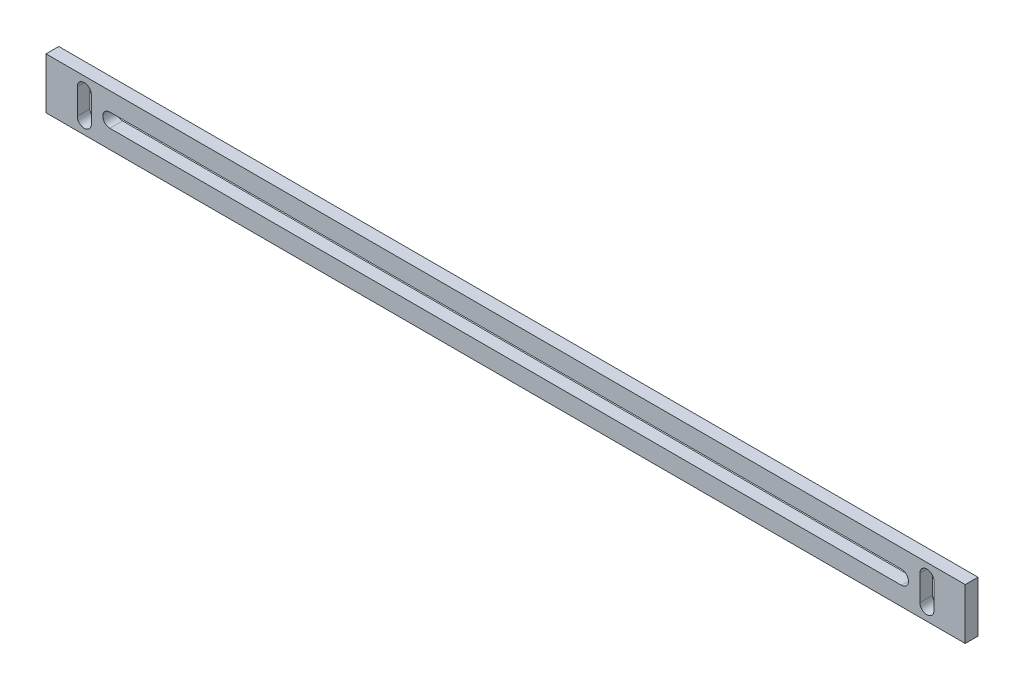
ISO-10303-21;
HEADER;
FILE_DESCRIPTION(('STEP AP214'),'2;1');
FILE_NAME('part.step','',(''),(''),'','','');
FILE_SCHEMA(('AUTOMOTIVE_DESIGN { 1 0 10303 214 1 1 1 1 }'));
ENDSEC;
DATA;
#1=APPLICATION_CONTEXT('core data for automotive mechanical design processes');
#2=APPLICATION_PROTOCOL_DEFINITION('international standard','automotive_design',2000,#1);
#3=PRODUCT_CONTEXT('',#1,'mechanical');
#4=PRODUCT('Part','Part','',(#3));
#5=PRODUCT_RELATED_PRODUCT_CATEGORY('part','',(#4));
#6=PRODUCT_DEFINITION_FORMATION('','',#4);
#7=PRODUCT_DEFINITION_CONTEXT('part definition',#1,'design');
#8=PRODUCT_DEFINITION('design','',#6,#7);
#9=PRODUCT_DEFINITION_SHAPE('','',#8);
#10=(LENGTH_UNIT() NAMED_UNIT(*) SI_UNIT(.MILLI.,.METRE.));
#11=(NAMED_UNIT(*) PLANE_ANGLE_UNIT() SI_UNIT($,.RADIAN.));
#12=(NAMED_UNIT(*) SI_UNIT($,.STERADIAN.) SOLID_ANGLE_UNIT());
#13=UNCERTAINTY_MEASURE_WITH_UNIT(LENGTH_MEASURE(1.E-05),#10,'distance_accuracy_value','');
#14=(GEOMETRIC_REPRESENTATION_CONTEXT(3) GLOBAL_UNCERTAINTY_ASSIGNED_CONTEXT((#13)) GLOBAL_UNIT_ASSIGNED_CONTEXT((#10,
#11,#12)) REPRESENTATION_CONTEXT('',''));
#15=CARTESIAN_POINT('',(0.,0.,0.));
#16=DIRECTION('',(0.,0.,1.));
#17=DIRECTION('',(1.,0.,0.));
#18=AXIS2_PLACEMENT_3D('',#15,#16,#17);
#19=CARTESIAN_POINT('',(0.,0.,5.));
#20=DIRECTION('',(0.,0.,1.));
#21=DIRECTION('',(1.,0.,0.));
#22=AXIS2_PLACEMENT_3D('',#19,#20,#21);
#23=PLANE('',#22);
#24=DIRECTION('',(0.,1.,0.));
#25=VECTOR('',#24,1.);
#26=CARTESIAN_POINT('',(162.25,0.,5.));
#27=LINE('',#26,#25);
#28=CARTESIAN_POINT('',(162.25,-5.,5.));
#29=VERTEX_POINT('',#28);
#30=CARTESIAN_POINT('',(162.25,5.,5.));
#31=VERTEX_POINT('',#30);
#32=EDGE_CURVE('E193',#29,#31,#27,.T.);
#33=ORIENTED_EDGE('',*,*,#32,.T.);
#34=CARTESIAN_POINT('',(165.,5.,5.));
#35=DIRECTION('',(0.,0.,-1.));
#36=DIRECTION('',(-1.,0.,0.));
#37=AXIS2_PLACEMENT_3D('',#34,#35,#36);
#38=CIRCLE('',#37,2.75);
#39=CARTESIAN_POINT('',(167.75,5.,5.));
#40=VERTEX_POINT('',#39);
#41=EDGE_CURVE('E196',#31,#40,#38,.T.);
#42=ORIENTED_EDGE('',*,*,#41,.T.);
#43=DIRECTION('',(0.,1.,0.));
#44=VECTOR('',#43,1.);
#45=CARTESIAN_POINT('',(167.75,0.,5.));
#46=LINE('',#45,#44);
#47=CARTESIAN_POINT('',(167.75,-5.,5.));
#48=VERTEX_POINT('',#47);
#49=EDGE_CURVE('E200',#48,#40,#46,.T.);
#50=ORIENTED_EDGE('',*,*,#49,.F.);
#51=CARTESIAN_POINT('',(165.,-5.00000000000001,5.));
#52=DIRECTION('',(0.,0.,-1.));
#53=DIRECTION('',(-1.,0.,0.));
#54=AXIS2_PLACEMENT_3D('',#51,#52,#53);
#55=CIRCLE('',#54,2.75);
#56=EDGE_CURVE('E202',#48,#29,#55,.T.);
#57=ORIENTED_EDGE('',*,*,#56,.T.);
#58=EDGE_LOOP('',(#33,#42,#50,#57));
#59=FACE_BOUND('',#58,.T.);
#60=DIRECTION('',(-1.,0.,0.));
#61=VECTOR('',#60,1.);
#62=CARTESIAN_POINT('',(0.,-2.75000000000008,5.));
#63=LINE('',#62,#61);
#64=CARTESIAN_POINT('',(155.,-2.75000000000008,5.));
#65=VERTEX_POINT('',#64);
#66=CARTESIAN_POINT('',(-155.,-2.75000000000008,5.));
#67=VERTEX_POINT('',#66);
#68=EDGE_CURVE('E222',#65,#67,#63,.T.);
#69=ORIENTED_EDGE('',*,*,#68,.T.);
#70=CARTESIAN_POINT('',(-155.,0.,5.));
#71=DIRECTION('',(0.,0.,-1.));
#72=DIRECTION('',(-1.,0.,0.));
#73=AXIS2_PLACEMENT_3D('',#70,#71,#72);
#74=CIRCLE('',#73,2.75000000000004);
#75=CARTESIAN_POINT('',(-155.,2.75000000000004,5.));
#76=VERTEX_POINT('',#75);
#77=EDGE_CURVE('E225',#67,#76,#74,.T.);
#78=ORIENTED_EDGE('',*,*,#77,.T.);
#79=DIRECTION('',(-1.,0.,0.));
#80=VECTOR('',#79,1.);
#81=CARTESIAN_POINT('',(0.,2.75,5.));
#82=LINE('',#81,#80);
#83=CARTESIAN_POINT('',(155.,2.75,5.));
#84=VERTEX_POINT('',#83);
#85=EDGE_CURVE('E229',#84,#76,#82,.T.);
#86=ORIENTED_EDGE('',*,*,#85,.F.);
#87=CARTESIAN_POINT('',(155.,0.,5.));
#88=DIRECTION('',(0.,0.,-1.));
#89=DIRECTION('',(-1.,0.,0.));
#90=AXIS2_PLACEMENT_3D('',#87,#88,#89);
#91=CIRCLE('',#90,2.75000000000004);
#92=EDGE_CURVE('E231',#84,#65,#91,.T.);
#93=ORIENTED_EDGE('',*,*,#92,.T.);
#94=EDGE_LOOP('',(#69,#78,#86,#93));
#95=FACE_BOUND('',#94,.T.);
#96=DIRECTION('',(-1.,0.,0.));
#97=VECTOR('',#96,1.);
#98=CARTESIAN_POINT('',(0.,10.,5.));
#99=LINE('',#98,#97);
#100=CARTESIAN_POINT('',(180.,9.99999999999998,5.));
#101=VERTEX_POINT('',#100);
#102=CARTESIAN_POINT('',(-180.,10.,5.));
#103=VERTEX_POINT('',#102);
#104=EDGE_CURVE('E49',#101,#103,#99,.T.);
#105=ORIENTED_EDGE('',*,*,#104,.T.);
#106=DIRECTION('',(0.,1.,0.));
#107=VECTOR('',#106,1.);
#108=CARTESIAN_POINT('',(-180.,-10.,5.));
#109=LINE('',#108,#107);
#110=CARTESIAN_POINT('',(-180.,-10.,5.));
#111=VERTEX_POINT('',#110);
#112=EDGE_CURVE('E173',#111,#103,#109,.T.);
#113=ORIENTED_EDGE('',*,*,#112,.F.);
#114=DIRECTION('',(1.,0.,0.));
#115=VECTOR('',#114,1.);
#116=CARTESIAN_POINT('',(0.,-10.,5.));
#117=LINE('',#116,#115);
#118=CARTESIAN_POINT('',(180.,-10.,5.));
#119=VERTEX_POINT('',#118);
#120=EDGE_CURVE('E11',#111,#119,#117,.T.);
#121=ORIENTED_EDGE('',*,*,#120,.T.);
#122=DIRECTION('',(0.,-1.,0.));
#123=VECTOR('',#122,1.);
#124=CARTESIAN_POINT('',(180.,-10.,5.));
#125=LINE('',#124,#123);
#126=EDGE_CURVE('E181',#101,#119,#125,.T.);
#127=ORIENTED_EDGE('',*,*,#126,.F.);
#128=EDGE_LOOP('',(#105,#113,#121,#127));
#129=FACE_BOUND('',#128,.T.);
#130=CARTESIAN_POINT('',(-165.,5.,5.));
#131=DIRECTION('',(0.,0.,-1.));
#132=DIRECTION('',(-1.,0.,0.));
#133=AXIS2_PLACEMENT_3D('',#130,#131,#132);
#134=CIRCLE('',#133,2.75);
#135=CARTESIAN_POINT('',(-167.75,5.00000000000003,5.));
#136=VERTEX_POINT('',#135);
#137=CARTESIAN_POINT('',(-162.25,5.00000000000003,5.));
#138=VERTEX_POINT('',#137);
#139=EDGE_CURVE('E260',#136,#138,#134,.T.);
#140=ORIENTED_EDGE('',*,*,#139,.T.);
#141=DIRECTION('',(0.,1.,0.));
#142=VECTOR('',#141,1.);
#143=CARTESIAN_POINT('',(-162.25,0.,5.));
#144=LINE('',#143,#142);
#145=CARTESIAN_POINT('',(-162.25,-5.00000000000003,5.));
#146=VERTEX_POINT('',#145);
#147=EDGE_CURVE('E251',#146,#138,#144,.T.);
#148=ORIENTED_EDGE('',*,*,#147,.F.);
#149=CARTESIAN_POINT('',(-165.,-5.,5.));
#150=DIRECTION('',(0.,0.,-1.));
#151=DIRECTION('',(-1.,0.,0.));
#152=AXIS2_PLACEMENT_3D('',#149,#150,#151);
#153=CIRCLE('',#152,2.75);
#154=CARTESIAN_POINT('',(-167.75,-5.00000000000003,5.));
#155=VERTEX_POINT('',#154);
#156=EDGE_CURVE('E253',#146,#155,#153,.T.);
#157=ORIENTED_EDGE('',*,*,#156,.T.);
#158=DIRECTION('',(0.,1.,0.));
#159=VECTOR('',#158,1.);
#160=CARTESIAN_POINT('',(-167.75,0.,5.));
#161=LINE('',#160,#159);
#162=EDGE_CURVE('E257',#155,#136,#161,.T.);
#163=ORIENTED_EDGE('',*,*,#162,.T.);
#164=EDGE_LOOP('',(#140,#148,#157,#163));
#165=FACE_BOUND('',#164,.T.);
#166=ADVANCED_FACE('F40',(#59,#95,#129,#165),#23,.T.);
#167=CARTESIAN_POINT('',(0.,0.,0.));
#168=DIRECTION('',(0.,0.,1.));
#169=DIRECTION('',(1.,0.,0.));
#170=AXIS2_PLACEMENT_3D('',#167,#168,#169);
#171=PLANE('',#170);
#172=CARTESIAN_POINT('',(165.,5.,0.));
#173=DIRECTION('',(0.,0.,-1.));
#174=DIRECTION('',(-1.,0.,0.));
#175=AXIS2_PLACEMENT_3D('',#172,#173,#174);
#176=CIRCLE('',#175,2.75);
#177=CARTESIAN_POINT('',(162.25,5.,0.));
#178=VERTEX_POINT('',#177);
#179=CARTESIAN_POINT('',(167.75,5.,0.));
#180=VERTEX_POINT('',#179);
#181=EDGE_CURVE('E208',#178,#180,#176,.T.);
#182=ORIENTED_EDGE('',*,*,#181,.F.);
#183=DIRECTION('',(0.,1.,0.));
#184=VECTOR('',#183,1.);
#185=CARTESIAN_POINT('',(162.25,0.,0.));
#186=LINE('',#185,#184);
#187=CARTESIAN_POINT('',(162.25,-5.,0.));
#188=VERTEX_POINT('',#187);
#189=EDGE_CURVE('E206',#188,#178,#186,.T.);
#190=ORIENTED_EDGE('',*,*,#189,.F.);
#191=CARTESIAN_POINT('',(165.,-5.00000000000001,0.));
#192=DIRECTION('',(0.,0.,-1.));
#193=DIRECTION('',(-1.,0.,0.));
#194=AXIS2_PLACEMENT_3D('',#191,#192,#193);
#195=CIRCLE('',#194,2.75);
#196=CARTESIAN_POINT('',(167.75,-5.,0.));
#197=VERTEX_POINT('',#196);
#198=EDGE_CURVE('E197',#197,#188,#195,.T.);
#199=ORIENTED_EDGE('',*,*,#198,.F.);
#200=DIRECTION('',(0.,1.,0.));
#201=VECTOR('',#200,1.);
#202=CARTESIAN_POINT('',(167.75,0.,0.));
#203=LINE('',#202,#201);
#204=EDGE_CURVE('E211',#197,#180,#203,.T.);
#205=ORIENTED_EDGE('',*,*,#204,.T.);
#206=EDGE_LOOP('',(#182,#190,#199,#205));
#207=FACE_BOUND('',#206,.T.);
#208=CARTESIAN_POINT('',(-155.,0.,0.));
#209=DIRECTION('',(0.,0.,-1.));
#210=DIRECTION('',(-1.,0.,0.));
#211=AXIS2_PLACEMENT_3D('',#208,#209,#210);
#212=CIRCLE('',#211,2.75000000000004);
#213=CARTESIAN_POINT('',(-155.,-2.75000000000004,0.));
#214=VERTEX_POINT('',#213);
#215=CARTESIAN_POINT('',(-155.,2.75,0.));
#216=VERTEX_POINT('',#215);
#217=EDGE_CURVE('E237',#214,#216,#212,.T.);
#218=ORIENTED_EDGE('',*,*,#217,.F.);
#219=DIRECTION('',(-1.,0.,0.));
#220=VECTOR('',#219,1.);
#221=CARTESIAN_POINT('',(0.,-2.75000000000008,0.));
#222=LINE('',#221,#220);
#223=CARTESIAN_POINT('',(155.,-2.75000000000008,0.));
#224=VERTEX_POINT('',#223);
#225=EDGE_CURVE('E235',#224,#214,#222,.T.);
#226=ORIENTED_EDGE('',*,*,#225,.F.);
#227=CARTESIAN_POINT('',(155.,0.,0.));
#228=DIRECTION('',(0.,0.,-1.));
#229=DIRECTION('',(-1.,0.,0.));
#230=AXIS2_PLACEMENT_3D('',#227,#228,#229);
#231=CIRCLE('',#230,2.75000000000004);
#232=CARTESIAN_POINT('',(155.,2.75,0.));
#233=VERTEX_POINT('',#232);
#234=EDGE_CURVE('E226',#233,#224,#231,.T.);
#235=ORIENTED_EDGE('',*,*,#234,.F.);
#236=DIRECTION('',(-1.,0.,0.));
#237=VECTOR('',#236,1.);
#238=CARTESIAN_POINT('',(0.,2.75,0.));
#239=LINE('',#238,#237);
#240=EDGE_CURVE('E240',#233,#216,#239,.T.);
#241=ORIENTED_EDGE('',*,*,#240,.T.);
#242=EDGE_LOOP('',(#218,#226,#235,#241));
#243=FACE_BOUND('',#242,.T.);
#244=DIRECTION('',(-1.,0.,0.));
#245=VECTOR('',#244,1.);
#246=CARTESIAN_POINT('',(0.,10.,0.));
#247=LINE('',#246,#245);
#248=CARTESIAN_POINT('',(180.,9.99999999999998,0.));
#249=VERTEX_POINT('',#248);
#250=CARTESIAN_POINT('',(-180.,10.,0.));
#251=VERTEX_POINT('',#250);
#252=EDGE_CURVE('E156',#249,#251,#247,.T.);
#253=ORIENTED_EDGE('',*,*,#252,.F.);
#254=DIRECTION('',(0.,-1.,0.));
#255=VECTOR('',#254,1.);
#256=CARTESIAN_POINT('',(180.,-10.,0.));
#257=LINE('',#256,#255);
#258=CARTESIAN_POINT('',(180.,-10.,0.));
#259=VERTEX_POINT('',#258);
#260=EDGE_CURVE('E179',#249,#259,#257,.T.);
#261=ORIENTED_EDGE('',*,*,#260,.T.);
#262=DIRECTION('',(1.,0.,0.));
#263=VECTOR('',#262,1.);
#264=CARTESIAN_POINT('',(0.,-10.,0.));
#265=LINE('',#264,#263);
#266=CARTESIAN_POINT('',(-180.,-10.,0.));
#267=VERTEX_POINT('',#266);
#268=EDGE_CURVE('E44',#267,#259,#265,.T.);
#269=ORIENTED_EDGE('',*,*,#268,.F.);
#270=DIRECTION('',(0.,1.,0.));
#271=VECTOR('',#270,1.);
#272=CARTESIAN_POINT('',(-180.,-10.,0.));
#273=LINE('',#272,#271);
#274=EDGE_CURVE('E171',#267,#251,#273,.T.);
#275=ORIENTED_EDGE('',*,*,#274,.T.);
#276=EDGE_LOOP('',(#253,#261,#269,#275));
#277=FACE_BOUND('',#276,.T.);
#278=DIRECTION('',(0.,1.,0.));
#279=VECTOR('',#278,1.);
#280=CARTESIAN_POINT('',(-162.25,0.,0.));
#281=LINE('',#280,#279);
#282=CARTESIAN_POINT('',(-162.25,-5.,0.));
#283=VERTEX_POINT('',#282);
#284=CARTESIAN_POINT('',(-162.25,5.00000000000003,0.));
#285=VERTEX_POINT('',#284);
#286=EDGE_CURVE('E191',#283,#285,#281,.T.);
#287=ORIENTED_EDGE('',*,*,#286,.T.);
#288=CARTESIAN_POINT('',(-165.,5.,0.));
#289=DIRECTION('',(0.,0.,-1.));
#290=DIRECTION('',(-1.,0.,0.));
#291=AXIS2_PLACEMENT_3D('',#288,#289,#290);
#292=CIRCLE('',#291,2.75);
#293=CARTESIAN_POINT('',(-167.75,5.00000000000003,0.));
#294=VERTEX_POINT('',#293);
#295=EDGE_CURVE('E254',#294,#285,#292,.T.);
#296=ORIENTED_EDGE('',*,*,#295,.F.);
#297=DIRECTION('',(0.,1.,0.));
#298=VECTOR('',#297,1.);
#299=CARTESIAN_POINT('',(-167.75,0.,0.));
#300=LINE('',#299,#298);
#301=CARTESIAN_POINT('',(-167.75,-5.00000000000003,0.));
#302=VERTEX_POINT('',#301);
#303=EDGE_CURVE('E269',#302,#294,#300,.T.);
#304=ORIENTED_EDGE('',*,*,#303,.F.);
#305=CARTESIAN_POINT('',(-165.,-5.,0.));
#306=DIRECTION('',(0.,0.,-1.));
#307=DIRECTION('',(-1.,0.,0.));
#308=AXIS2_PLACEMENT_3D('',#305,#306,#307);
#309=CIRCLE('',#308,2.75);
#310=EDGE_CURVE('E266',#283,#302,#309,.T.);
#311=ORIENTED_EDGE('',*,*,#310,.F.);
#312=EDGE_LOOP('',(#287,#296,#304,#311));
#313=FACE_BOUND('',#312,.T.);
#314=ADVANCED_FACE('F176',(#207,#243,#277,#313),#171,.F.);
#315=CARTESIAN_POINT('',(0.,10.,5.));
#316=DIRECTION('',(0.,-1.,0.));
#317=DIRECTION('',(0.,0.,-1.));
#318=AXIS2_PLACEMENT_3D('',#315,#316,#317);
#319=PLANE('',#318);
#320=ORIENTED_EDGE('',*,*,#252,.T.);
#321=DIRECTION('',(0.,0.,-1.));
#322=VECTOR('',#321,1.);
#323=CARTESIAN_POINT('',(-180.,10.,5.));
#324=LINE('',#323,#322);
#325=EDGE_CURVE('E158',#103,#251,#324,.T.);
#326=ORIENTED_EDGE('',*,*,#325,.F.);
#327=ORIENTED_EDGE('',*,*,#104,.F.);
#328=DIRECTION('',(0.,0.,-1.));
#329=VECTOR('',#328,1.);
#330=CARTESIAN_POINT('',(180.,9.99999999999998,5.));
#331=LINE('',#330,#329);
#332=EDGE_CURVE('E161',#101,#249,#331,.T.);
#333=ORIENTED_EDGE('',*,*,#332,.T.);
#334=EDGE_LOOP('',(#320,#326,#327,#333));
#335=FACE_BOUND('',#334,.T.);
#336=ADVANCED_FACE('F42',(#335),#319,.F.);
#337=CARTESIAN_POINT('',(0.,-10.,5.));
#338=DIRECTION('',(0.,1.,0.));
#339=DIRECTION('',(0.,0.,1.));
#340=AXIS2_PLACEMENT_3D('',#337,#338,#339);
#341=PLANE('',#340);
#342=ORIENTED_EDGE('',*,*,#268,.T.);
#343=DIRECTION('',(0.,0.,-1.));
#344=VECTOR('',#343,1.);
#345=CARTESIAN_POINT('',(180.,-10.,5.));
#346=LINE('',#345,#344);
#347=EDGE_CURVE('E188',#119,#259,#346,.T.);
#348=ORIENTED_EDGE('',*,*,#347,.F.);
#349=ORIENTED_EDGE('',*,*,#120,.F.);
#350=DIRECTION('',(0.,0.,-1.));
#351=VECTOR('',#350,1.);
#352=CARTESIAN_POINT('',(-180.,-10.,5.));
#353=LINE('',#352,#351);
#354=EDGE_CURVE('E174',#111,#267,#353,.T.);
#355=ORIENTED_EDGE('',*,*,#354,.T.);
#356=EDGE_LOOP('',(#342,#348,#349,#355));
#357=FACE_BOUND('',#356,.T.);
#358=ADVANCED_FACE('F285',(#357),#341,.F.);
#359=CARTESIAN_POINT('',(-162.25,0.,5.));
#360=DIRECTION('',(-1.,0.,0.));
#361=DIRECTION('',(0.,0.,1.));
#362=AXIS2_PLACEMENT_3D('',#359,#360,#361);
#363=PLANE('',#362);
#364=ORIENTED_EDGE('',*,*,#286,.F.);
#365=DIRECTION('',(0.,0.,-1.));
#366=VECTOR('',#365,1.);
#367=CARTESIAN_POINT('',(-162.25,-5.00000000000003,5.));
#368=LINE('',#367,#366);
#369=EDGE_CURVE('E263',#146,#283,#368,.T.);
#370=ORIENTED_EDGE('',*,*,#369,.F.);
#371=ORIENTED_EDGE('',*,*,#147,.T.);
#372=DIRECTION('',(0.,0.,-1.));
#373=VECTOR('',#372,1.);
#374=CARTESIAN_POINT('',(-162.25,5.00000000000003,5.));
#375=LINE('',#374,#373);
#376=EDGE_CURVE('E238',#138,#285,#375,.T.);
#377=ORIENTED_EDGE('',*,*,#376,.T.);
#378=EDGE_LOOP('',(#364,#370,#371,#377));
#379=FACE_BOUND('',#378,.T.);
#380=ADVANCED_FACE('F299',(#379),#363,.T.);
#381=CARTESIAN_POINT('',(-165.,5.,5.));
#382=DIRECTION('',(0.,0.,-1.));
#383=DIRECTION('',(-1.,0.,0.));
#384=AXIS2_PLACEMENT_3D('',#381,#382,#383);
#385=CYLINDRICAL_SURFACE('',#384,2.75);
#386=ORIENTED_EDGE('',*,*,#295,.T.);
#387=ORIENTED_EDGE('',*,*,#376,.F.);
#388=ORIENTED_EDGE('',*,*,#139,.F.);
#389=DIRECTION('',(0.,0.,-1.));
#390=VECTOR('',#389,1.);
#391=CARTESIAN_POINT('',(-167.75,5.00000000000003,5.));
#392=LINE('',#391,#390);
#393=EDGE_CURVE('E275',#136,#294,#392,.T.);
#394=ORIENTED_EDGE('',*,*,#393,.T.);
#395=EDGE_LOOP('',(#386,#387,#388,#394));
#396=FACE_BOUND('',#395,.T.);
#397=ADVANCED_FACE('F296',(#396),#385,.F.);
#398=CARTESIAN_POINT('',(-167.75,0.,5.));
#399=DIRECTION('',(-1.,0.,0.));
#400=DIRECTION('',(0.,0.,1.));
#401=AXIS2_PLACEMENT_3D('',#398,#399,#400);
#402=PLANE('',#401);
#403=ORIENTED_EDGE('',*,*,#303,.T.);
#404=ORIENTED_EDGE('',*,*,#393,.F.);
#405=ORIENTED_EDGE('',*,*,#162,.F.);
#406=DIRECTION('',(0.,0.,-1.));
#407=VECTOR('',#406,1.);
#408=CARTESIAN_POINT('',(-167.75,-5.00000000000003,5.));
#409=LINE('',#408,#407);
#410=EDGE_CURVE('E277',#155,#302,#409,.T.);
#411=ORIENTED_EDGE('',*,*,#410,.T.);
#412=EDGE_LOOP('',(#403,#404,#405,#411));
#413=FACE_BOUND('',#412,.T.);
#414=ADVANCED_FACE('F307',(#413),#402,.F.);
#415=CARTESIAN_POINT('',(-165.,-5.,5.));
#416=DIRECTION('',(0.,0.,-1.));
#417=DIRECTION('',(-1.,0.,0.));
#418=AXIS2_PLACEMENT_3D('',#415,#416,#417);
#419=CYLINDRICAL_SURFACE('',#418,2.75);
#420=ORIENTED_EDGE('',*,*,#310,.T.);
#421=ORIENTED_EDGE('',*,*,#410,.F.);
#422=ORIENTED_EDGE('',*,*,#156,.F.);
#423=ORIENTED_EDGE('',*,*,#369,.T.);
#424=EDGE_LOOP('',(#420,#421,#422,#423));
#425=FACE_BOUND('',#424,.T.);
#426=ADVANCED_FACE('F304',(#425),#419,.F.);
#427=CARTESIAN_POINT('',(0.,-2.75000000000008,5.));
#428=DIRECTION('',(0.,-1.,0.));
#429=DIRECTION('',(1.,0.,0.));
#430=AXIS2_PLACEMENT_3D('',#427,#428,#429);
#431=PLANE('',#430);
#432=ORIENTED_EDGE('',*,*,#225,.T.);
#433=DIRECTION('',(0.,0.,-1.));
#434=VECTOR('',#433,1.);
#435=CARTESIAN_POINT('',(-155.,-2.75000000000008,5.));
#436=LINE('',#435,#434);
#437=EDGE_CURVE('E234',#67,#214,#436,.T.);
#438=ORIENTED_EDGE('',*,*,#437,.F.);
#439=ORIENTED_EDGE('',*,*,#68,.F.);
#440=DIRECTION('',(0.,0.,-1.));
#441=VECTOR('',#440,1.);
#442=CARTESIAN_POINT('',(155.,-2.75000000000008,5.));
#443=LINE('',#442,#441);
#444=EDGE_CURVE('E209',#65,#224,#443,.T.);
#445=ORIENTED_EDGE('',*,*,#444,.T.);
#446=EDGE_LOOP('',(#432,#438,#439,#445));
#447=FACE_BOUND('',#446,.T.);
#448=ADVANCED_FACE('F328',(#447),#431,.F.);
#449=CARTESIAN_POINT('',(155.,0.,5.));
#450=DIRECTION('',(0.,0.,-1.));
#451=DIRECTION('',(-1.,0.,0.));
#452=AXIS2_PLACEMENT_3D('',#449,#450,#451);
#453=CYLINDRICAL_SURFACE('',#452,2.75000000000004);
#454=ORIENTED_EDGE('',*,*,#234,.T.);
#455=ORIENTED_EDGE('',*,*,#444,.F.);
#456=ORIENTED_EDGE('',*,*,#92,.F.);
#457=DIRECTION('',(0.,0.,-1.));
#458=VECTOR('',#457,1.);
#459=CARTESIAN_POINT('',(155.,2.75,5.));
#460=LINE('',#459,#458);
#461=EDGE_CURVE('E246',#84,#233,#460,.T.);
#462=ORIENTED_EDGE('',*,*,#461,.T.);
#463=EDGE_LOOP('',(#454,#455,#456,#462));
#464=FACE_BOUND('',#463,.T.);
#465=ADVANCED_FACE('F333',(#464),#453,.F.);
#466=CARTESIAN_POINT('',(0.,2.75,5.));
#467=DIRECTION('',(0.,-1.,0.));
#468=DIRECTION('',(1.,0.,0.));
#469=AXIS2_PLACEMENT_3D('',#466,#467,#468);
#470=PLANE('',#469);
#471=ORIENTED_EDGE('',*,*,#240,.F.);
#472=ORIENTED_EDGE('',*,*,#461,.F.);
#473=ORIENTED_EDGE('',*,*,#85,.T.);
#474=DIRECTION('',(0.,0.,-1.));
#475=VECTOR('',#474,1.);
#476=CARTESIAN_POINT('',(-155.,2.75,5.));
#477=LINE('',#476,#475);
#478=EDGE_CURVE('E65',#76,#216,#477,.T.);
#479=ORIENTED_EDGE('',*,*,#478,.T.);
#480=EDGE_LOOP('',(#471,#472,#473,#479));
#481=FACE_BOUND('',#480,.T.);
#482=ADVANCED_FACE('F339',(#481),#470,.T.);
#483=CARTESIAN_POINT('',(-155.,0.,5.));
#484=DIRECTION('',(0.,0.,-1.));
#485=DIRECTION('',(-1.,0.,0.));
#486=AXIS2_PLACEMENT_3D('',#483,#484,#485);
#487=CYLINDRICAL_SURFACE('',#486,2.75000000000004);
#488=ORIENTED_EDGE('',*,*,#217,.T.);
#489=ORIENTED_EDGE('',*,*,#478,.F.);
#490=ORIENTED_EDGE('',*,*,#77,.F.);
#491=ORIENTED_EDGE('',*,*,#437,.T.);
#492=EDGE_LOOP('',(#488,#489,#490,#491));
#493=FACE_BOUND('',#492,.T.);
#494=ADVANCED_FACE('F335',(#493),#487,.F.);
#495=CARTESIAN_POINT('',(162.25,0.,5.));
#496=DIRECTION('',(-1.,0.,0.));
#497=DIRECTION('',(0.,0.,1.));
#498=AXIS2_PLACEMENT_3D('',#495,#496,#497);
#499=PLANE('',#498);
#500=ORIENTED_EDGE('',*,*,#189,.T.);
#501=DIRECTION('',(0.,0.,-1.));
#502=VECTOR('',#501,1.);
#503=CARTESIAN_POINT('',(162.25,5.,5.));
#504=LINE('',#503,#502);
#505=EDGE_CURVE('E205',#31,#178,#504,.T.);
#506=ORIENTED_EDGE('',*,*,#505,.F.);
#507=ORIENTED_EDGE('',*,*,#32,.F.);
#508=DIRECTION('',(0.,0.,-1.));
#509=VECTOR('',#508,1.);
#510=CARTESIAN_POINT('',(162.25,-5.,5.));
#511=LINE('',#510,#509);
#512=EDGE_CURVE('E166',#29,#188,#511,.T.);
#513=ORIENTED_EDGE('',*,*,#512,.T.);
#514=EDGE_LOOP('',(#500,#506,#507,#513));
#515=FACE_BOUND('',#514,.T.);
#516=ADVANCED_FACE('F338',(#515),#499,.F.);
#517=CARTESIAN_POINT('',(165.,-5.00000000000001,5.));
#518=DIRECTION('',(0.,0.,-1.));
#519=DIRECTION('',(-1.,0.,0.));
#520=AXIS2_PLACEMENT_3D('',#517,#518,#519);
#521=CYLINDRICAL_SURFACE('',#520,2.75);
#522=ORIENTED_EDGE('',*,*,#198,.T.);
#523=ORIENTED_EDGE('',*,*,#512,.F.);
#524=ORIENTED_EDGE('',*,*,#56,.F.);
#525=DIRECTION('',(0.,0.,-1.));
#526=VECTOR('',#525,1.);
#527=CARTESIAN_POINT('',(167.75,-5.,5.));
#528=LINE('',#527,#526);
#529=EDGE_CURVE('E217',#48,#197,#528,.T.);
#530=ORIENTED_EDGE('',*,*,#529,.T.);
#531=EDGE_LOOP('',(#522,#523,#524,#530));
#532=FACE_BOUND('',#531,.T.);
#533=ADVANCED_FACE('F348',(#532),#521,.F.);
#534=CARTESIAN_POINT('',(167.75,0.,5.));
#535=DIRECTION('',(-1.,0.,0.));
#536=DIRECTION('',(0.,0.,1.));
#537=AXIS2_PLACEMENT_3D('',#534,#535,#536);
#538=PLANE('',#537);
#539=ORIENTED_EDGE('',*,*,#204,.F.);
#540=ORIENTED_EDGE('',*,*,#529,.F.);
#541=ORIENTED_EDGE('',*,*,#49,.T.);
#542=DIRECTION('',(0.,0.,-1.));
#543=VECTOR('',#542,1.);
#544=CARTESIAN_POINT('',(167.75,5.,5.));
#545=LINE('',#544,#543);
#546=EDGE_CURVE('E57',#40,#180,#545,.T.);
#547=ORIENTED_EDGE('',*,*,#546,.T.);
#548=EDGE_LOOP('',(#539,#540,#541,#547));
#549=FACE_BOUND('',#548,.T.);
#550=ADVANCED_FACE('F353',(#549),#538,.T.);
#551=CARTESIAN_POINT('',(165.,5.,5.));
#552=DIRECTION('',(0.,0.,-1.));
#553=DIRECTION('',(-1.,0.,0.));
#554=AXIS2_PLACEMENT_3D('',#551,#552,#553);
#555=CYLINDRICAL_SURFACE('',#554,2.75);
#556=ORIENTED_EDGE('',*,*,#181,.T.);
#557=ORIENTED_EDGE('',*,*,#546,.F.);
#558=ORIENTED_EDGE('',*,*,#41,.F.);
#559=ORIENTED_EDGE('',*,*,#505,.T.);
#560=EDGE_LOOP('',(#556,#557,#558,#559));
#561=FACE_BOUND('',#560,.T.);
#562=ADVANCED_FACE('F350',(#561),#555,.F.);
#563=CARTESIAN_POINT('',(180.,-10.,5.));
#564=DIRECTION('',(1.,0.,0.));
#565=DIRECTION('',(0.,0.,-1.));
#566=AXIS2_PLACEMENT_3D('',#563,#564,#565);
#567=PLANE('',#566);
#568=ORIENTED_EDGE('',*,*,#260,.F.);
#569=ORIENTED_EDGE('',*,*,#332,.F.);
#570=ORIENTED_EDGE('',*,*,#126,.T.);
#571=ORIENTED_EDGE('',*,*,#347,.T.);
#572=EDGE_LOOP('',(#568,#569,#570,#571));
#573=FACE_BOUND('',#572,.T.);
#574=ADVANCED_FACE('F287',(#573),#567,.T.);
#575=CARTESIAN_POINT('',(-180.,-10.,5.));
#576=DIRECTION('',(-1.,0.,0.));
#577=DIRECTION('',(0.,0.,1.));
#578=AXIS2_PLACEMENT_3D('',#575,#576,#577);
#579=PLANE('',#578);
#580=ORIENTED_EDGE('',*,*,#274,.F.);
#581=ORIENTED_EDGE('',*,*,#354,.F.);
#582=ORIENTED_EDGE('',*,*,#112,.T.);
#583=ORIENTED_EDGE('',*,*,#325,.T.);
#584=EDGE_LOOP('',(#580,#581,#582,#583));
#585=FACE_BOUND('',#584,.T.);
#586=ADVANCED_FACE('F169',(#585),#579,.T.);
#587=CLOSED_SHELL('',(#166,#314,#336,#358,#380,#397,#414,#426,#448,#465,#482,#494,#516,#533,
#550,#562,#574,#586));
#588=MANIFOLD_SOLID_BREP('B2',#587);
#589=ADVANCED_BREP_SHAPE_REPRESENTATION('',(#18,#588),#14);
#590=SHAPE_DEFINITION_REPRESENTATION(#9,#589);
ENDSEC;
END-ISO-10303-21;
